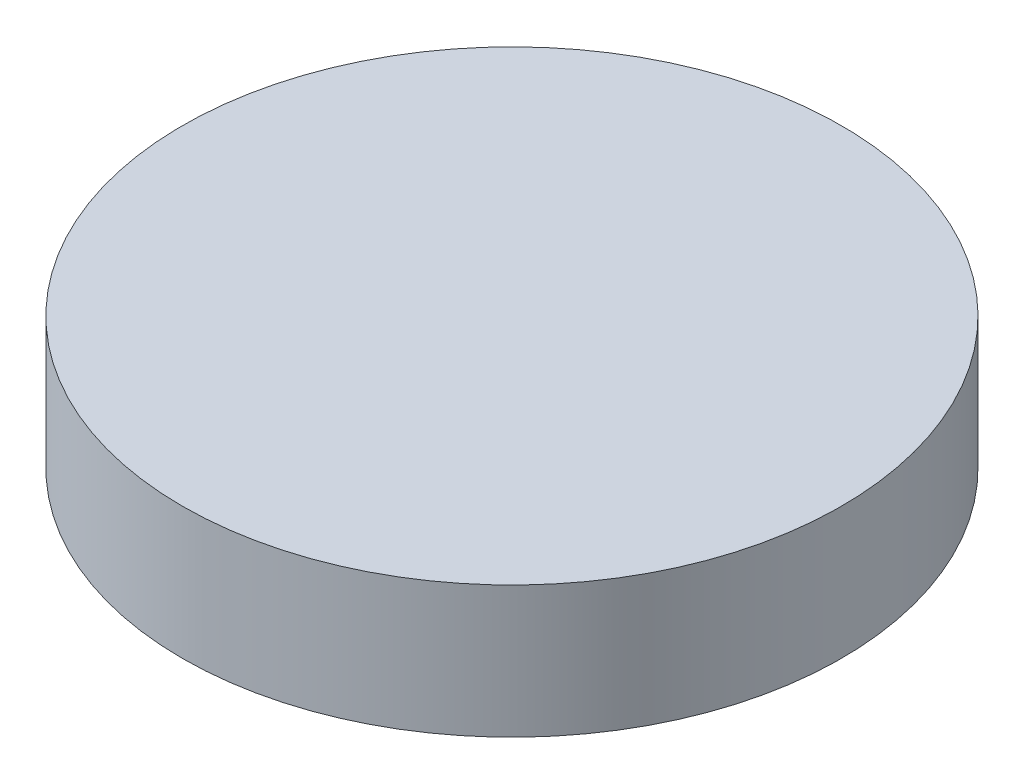
ISO-10303-21;
HEADER;
FILE_DESCRIPTION(('STEP AP214'),'2;1');
FILE_NAME('part.step','',(''),(''),'','','');
FILE_SCHEMA(('AUTOMOTIVE_DESIGN { 1 0 10303 214 1 1 1 1 }'));
ENDSEC;
DATA;
#1=APPLICATION_CONTEXT('core data for automotive mechanical design processes');
#2=APPLICATION_PROTOCOL_DEFINITION('international standard','automotive_design',2000,#1);
#3=PRODUCT_CONTEXT('',#1,'mechanical');
#4=PRODUCT('Part','Part','',(#3));
#5=PRODUCT_RELATED_PRODUCT_CATEGORY('part','',(#4));
#6=PRODUCT_DEFINITION_FORMATION('','',#4);
#7=PRODUCT_DEFINITION_CONTEXT('part definition',#1,'design');
#8=PRODUCT_DEFINITION('design','',#6,#7);
#9=PRODUCT_DEFINITION_SHAPE('','',#8);
#10=(LENGTH_UNIT() NAMED_UNIT(*) SI_UNIT(.MILLI.,.METRE.));
#11=(NAMED_UNIT(*) PLANE_ANGLE_UNIT() SI_UNIT($,.RADIAN.));
#12=(NAMED_UNIT(*) SI_UNIT($,.STERADIAN.) SOLID_ANGLE_UNIT());
#13=UNCERTAINTY_MEASURE_WITH_UNIT(LENGTH_MEASURE(1.E-05),#10,'distance_accuracy_value','');
#14=(GEOMETRIC_REPRESENTATION_CONTEXT(3) GLOBAL_UNCERTAINTY_ASSIGNED_CONTEXT((#13)) GLOBAL_UNIT_ASSIGNED_CONTEXT((#10,
#11,#12)) REPRESENTATION_CONTEXT('',''));
#15=CARTESIAN_POINT('',(0.,0.,0.));
#16=DIRECTION('',(0.,0.,1.));
#17=DIRECTION('',(1.,0.,0.));
#18=AXIS2_PLACEMENT_3D('',#15,#16,#17);
#19=CARTESIAN_POINT('',(0.,3.2,0.));
#20=DIRECTION('',(0.,-1.,0.));
#21=DIRECTION('',(0.,0.,-1.));
#22=AXIS2_PLACEMENT_3D('',#19,#20,#21);
#23=CYLINDRICAL_SURFACE('',#22,8.);
#24=CARTESIAN_POINT('',(0.,3.2,0.));
#25=DIRECTION('',(0.,1.,0.));
#26=DIRECTION('',(0.,0.,1.));
#27=AXIS2_PLACEMENT_3D('',#24,#25,#26);
#28=CIRCLE('',#27,8.);
#29=CARTESIAN_POINT('',(0.,3.2,8.));
#30=VERTEX_POINT('',#29);
#31=EDGE_CURVE('E10',#30,#30,#28,.T.);
#32=ORIENTED_EDGE('',*,*,#31,.F.);
#33=EDGE_LOOP('',(#32));
#34=FACE_BOUND('',#33,.T.);
#35=CARTESIAN_POINT('',(0.,0.,0.));
#36=DIRECTION('',(0.,1.,0.));
#37=DIRECTION('',(0.,0.,1.));
#38=AXIS2_PLACEMENT_3D('',#35,#36,#37);
#39=CIRCLE('',#38,8.);
#40=CARTESIAN_POINT('',(0.,0.,8.));
#41=VERTEX_POINT('',#40);
#42=EDGE_CURVE('E34',#41,#41,#39,.T.);
#43=ORIENTED_EDGE('',*,*,#42,.T.);
#44=EDGE_LOOP('',(#43));
#45=FACE_BOUND('',#44,.T.);
#46=ADVANCED_FACE('F31',(#34,#45),#23,.T.);
#47=CARTESIAN_POINT('',(0.,3.2,0.));
#48=DIRECTION('',(0.,1.,0.));
#49=DIRECTION('',(0.,0.,1.));
#50=AXIS2_PLACEMENT_3D('',#47,#48,#49);
#51=PLANE('',#50);
#52=ORIENTED_EDGE('',*,*,#31,.T.);
#53=EDGE_LOOP('',(#52));
#54=FACE_BOUND('',#53,.T.);
#55=ADVANCED_FACE('F46',(#54),#51,.T.);
#56=CARTESIAN_POINT('',(0.,0.,0.));
#57=DIRECTION('',(0.,1.,0.));
#58=DIRECTION('',(0.,0.,1.));
#59=AXIS2_PLACEMENT_3D('',#56,#57,#58);
#60=PLANE('',#59);
#61=ORIENTED_EDGE('',*,*,#42,.F.);
#62=EDGE_LOOP('',(#61));
#63=FACE_BOUND('',#62,.T.);
#64=ADVANCED_FACE('F44',(#63),#60,.F.);
#65=CLOSED_SHELL('',(#46,#55,#64));
#66=MANIFOLD_SOLID_BREP('B2',#65);
#67=ADVANCED_BREP_SHAPE_REPRESENTATION('',(#18,#66),#14);
#68=SHAPE_DEFINITION_REPRESENTATION(#9,#67);
ENDSEC;
END-ISO-10303-21;
